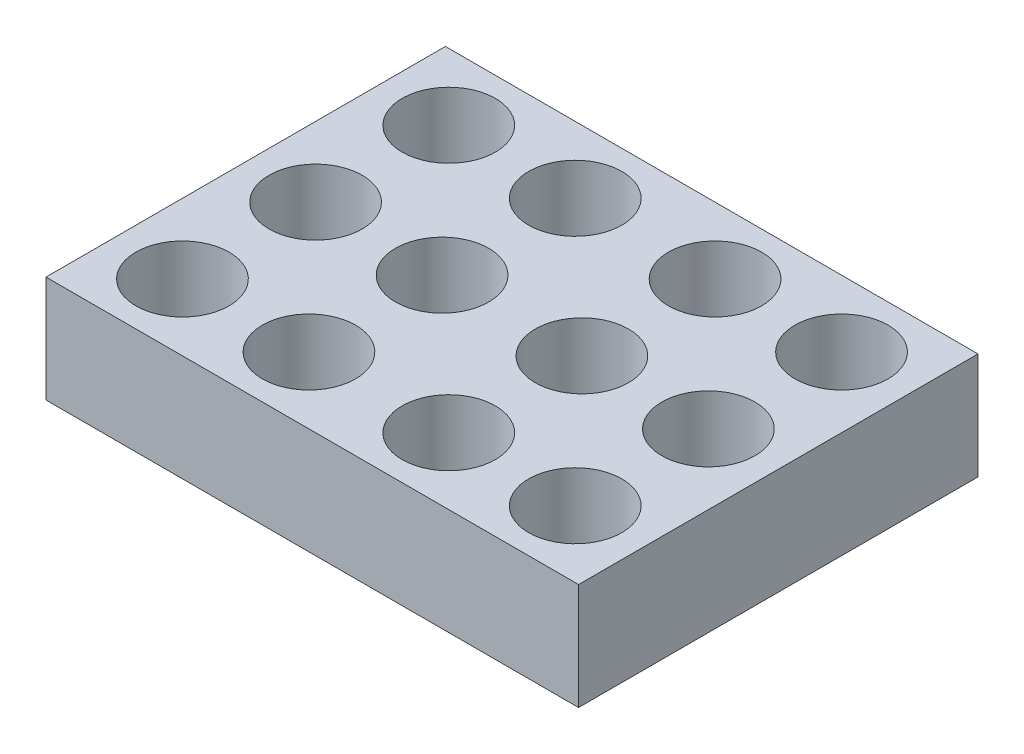
ISO-10303-21;
HEADER;
FILE_DESCRIPTION(('STEP AP214'),'2;1');
FILE_NAME('part.step','',(''),(''),'','','');
FILE_SCHEMA(('AUTOMOTIVE_DESIGN { 1 0 10303 214 1 1 1 1 }'));
ENDSEC;
DATA;
#1=APPLICATION_CONTEXT('core data for automotive mechanical design processes');
#2=APPLICATION_PROTOCOL_DEFINITION('international standard','automotive_design',2000,#1);
#3=PRODUCT_CONTEXT('',#1,'mechanical');
#4=PRODUCT('Part','Part','',(#3));
#5=PRODUCT_RELATED_PRODUCT_CATEGORY('part','',(#4));
#6=PRODUCT_DEFINITION_FORMATION('','',#4);
#7=PRODUCT_DEFINITION_CONTEXT('part definition',#1,'design');
#8=PRODUCT_DEFINITION('design','',#6,#7);
#9=PRODUCT_DEFINITION_SHAPE('','',#8);
#10=(LENGTH_UNIT() NAMED_UNIT(*) SI_UNIT(.MILLI.,.METRE.));
#11=(NAMED_UNIT(*) PLANE_ANGLE_UNIT() SI_UNIT($,.RADIAN.));
#12=(NAMED_UNIT(*) SI_UNIT($,.STERADIAN.) SOLID_ANGLE_UNIT());
#13=UNCERTAINTY_MEASURE_WITH_UNIT(LENGTH_MEASURE(1.E-05),#10,'distance_accuracy_value','');
#14=(GEOMETRIC_REPRESENTATION_CONTEXT(3) GLOBAL_UNCERTAINTY_ASSIGNED_CONTEXT((#13)) GLOBAL_UNIT_ASSIGNED_CONTEXT((#10,
#11,#12)) REPRESENTATION_CONTEXT('',''));
#15=CARTESIAN_POINT('',(0.,0.,0.));
#16=DIRECTION('',(0.,0.,1.));
#17=DIRECTION('',(1.,0.,0.));
#18=AXIS2_PLACEMENT_3D('',#15,#16,#17);
#19=CARTESIAN_POINT('',(200.,80.,150.));
#20=DIRECTION('',(-1.,0.,0.));
#21=DIRECTION('',(0.,0.,1.));
#22=AXIS2_PLACEMENT_3D('',#19,#20,#21);
#23=PLANE('',#22);
#24=DIRECTION('',(0.,0.,-1.));
#25=VECTOR('',#24,1.);
#26=CARTESIAN_POINT('',(200.,0.,150.));
#27=LINE('',#26,#25);
#28=CARTESIAN_POINT('',(200.,0.,150.));
#29=VERTEX_POINT('',#28);
#30=CARTESIAN_POINT('',(200.,0.,-150.));
#31=VERTEX_POINT('',#30);
#32=EDGE_CURVE('E107',#29,#31,#27,.T.);
#33=ORIENTED_EDGE('',*,*,#32,.T.);
#34=DIRECTION('',(0.,-1.,0.));
#35=VECTOR('',#34,1.);
#36=CARTESIAN_POINT('',(200.,80.,-150.));
#37=LINE('',#36,#35);
#38=CARTESIAN_POINT('',(200.,80.,-150.));
#39=VERTEX_POINT('',#38);
#40=EDGE_CURVE('E11',#39,#31,#37,.T.);
#41=ORIENTED_EDGE('',*,*,#40,.F.);
#42=DIRECTION('',(0.,0.,-1.));
#43=VECTOR('',#42,1.);
#44=CARTESIAN_POINT('',(200.,80.,150.));
#45=LINE('',#44,#43);
#46=CARTESIAN_POINT('',(200.,80.,150.));
#47=VERTEX_POINT('',#46);
#48=EDGE_CURVE('E91',#47,#39,#45,.T.);
#49=ORIENTED_EDGE('',*,*,#48,.F.);
#50=DIRECTION('',(0.,-1.,0.));
#51=VECTOR('',#50,1.);
#52=CARTESIAN_POINT('',(200.,80.,150.));
#53=LINE('',#52,#51);
#54=EDGE_CURVE('E103',#47,#29,#53,.T.);
#55=ORIENTED_EDGE('',*,*,#54,.T.);
#56=EDGE_LOOP('',(#33,#41,#49,#55));
#57=FACE_BOUND('',#56,.T.);
#58=ADVANCED_FACE('F39',(#57),#23,.F.);
#59=CARTESIAN_POINT('',(-200.,80.,-150.));
#60=DIRECTION('',(0.,0.,1.));
#61=DIRECTION('',(1.,0.,0.));
#62=AXIS2_PLACEMENT_3D('',#59,#60,#61);
#63=PLANE('',#62);
#64=DIRECTION('',(-1.,0.,0.));
#65=VECTOR('',#64,1.);
#66=CARTESIAN_POINT('',(-200.,0.,-150.));
#67=LINE('',#66,#65);
#68=CARTESIAN_POINT('',(-200.,0.,-150.));
#69=VERTEX_POINT('',#68);
#70=EDGE_CURVE('E96',#31,#69,#67,.T.);
#71=ORIENTED_EDGE('',*,*,#70,.T.);
#72=DIRECTION('',(0.,-1.,0.));
#73=VECTOR('',#72,1.);
#74=CARTESIAN_POINT('',(-200.,80.,-150.));
#75=LINE('',#74,#73);
#76=CARTESIAN_POINT('',(-200.,80.,-150.));
#77=VERTEX_POINT('',#76);
#78=EDGE_CURVE('E48',#77,#69,#75,.T.);
#79=ORIENTED_EDGE('',*,*,#78,.F.);
#80=DIRECTION('',(-1.,0.,0.));
#81=VECTOR('',#80,1.);
#82=CARTESIAN_POINT('',(-200.,80.,-150.));
#83=LINE('',#82,#81);
#84=EDGE_CURVE('E86',#39,#77,#83,.T.);
#85=ORIENTED_EDGE('',*,*,#84,.F.);
#86=ORIENTED_EDGE('',*,*,#40,.T.);
#87=EDGE_LOOP('',(#71,#79,#85,#86));
#88=FACE_BOUND('',#87,.T.);
#89=ADVANCED_FACE('F95',(#88),#63,.F.);
#90=CARTESIAN_POINT('',(-200.,80.,150.));
#91=DIRECTION('',(1.,0.,0.));
#92=DIRECTION('',(0.,0.,-1.));
#93=AXIS2_PLACEMENT_3D('',#90,#91,#92);
#94=PLANE('',#93);
#95=DIRECTION('',(0.,0.,1.));
#96=VECTOR('',#95,1.);
#97=CARTESIAN_POINT('',(-200.,0.,150.));
#98=LINE('',#97,#96);
#99=CARTESIAN_POINT('',(-200.,0.,150.));
#100=VERTEX_POINT('',#99);
#101=EDGE_CURVE('E73',#69,#100,#98,.T.);
#102=ORIENTED_EDGE('',*,*,#101,.T.);
#103=DIRECTION('',(0.,-1.,0.));
#104=VECTOR('',#103,1.);
#105=CARTESIAN_POINT('',(-200.,80.,150.));
#106=LINE('',#105,#104);
#107=CARTESIAN_POINT('',(-200.,80.,150.));
#108=VERTEX_POINT('',#107);
#109=EDGE_CURVE('E98',#108,#100,#106,.T.);
#110=ORIENTED_EDGE('',*,*,#109,.F.);
#111=DIRECTION('',(0.,0.,1.));
#112=VECTOR('',#111,1.);
#113=CARTESIAN_POINT('',(-200.,80.,150.));
#114=LINE('',#113,#112);
#115=EDGE_CURVE('E89',#77,#108,#114,.T.);
#116=ORIENTED_EDGE('',*,*,#115,.F.);
#117=ORIENTED_EDGE('',*,*,#78,.T.);
#118=EDGE_LOOP('',(#102,#110,#116,#117));
#119=FACE_BOUND('',#118,.T.);
#120=ADVANCED_FACE('F99',(#119),#94,.F.);
#121=CARTESIAN_POINT('',(-200.,80.,150.));
#122=DIRECTION('',(0.,0.,-1.));
#123=DIRECTION('',(-1.,0.,0.));
#124=AXIS2_PLACEMENT_3D('',#121,#122,#123);
#125=PLANE('',#124);
#126=DIRECTION('',(1.,0.,0.));
#127=VECTOR('',#126,1.);
#128=CARTESIAN_POINT('',(-200.,0.,150.));
#129=LINE('',#128,#127);
#130=EDGE_CURVE('E79',#100,#29,#129,.T.);
#131=ORIENTED_EDGE('',*,*,#130,.T.);
#132=ORIENTED_EDGE('',*,*,#54,.F.);
#133=DIRECTION('',(1.,0.,0.));
#134=VECTOR('',#133,1.);
#135=CARTESIAN_POINT('',(-200.,80.,150.));
#136=LINE('',#135,#134);
#137=EDGE_CURVE('E56',#108,#47,#136,.T.);
#138=ORIENTED_EDGE('',*,*,#137,.F.);
#139=ORIENTED_EDGE('',*,*,#109,.T.);
#140=EDGE_LOOP('',(#131,#132,#138,#139));
#141=FACE_BOUND('',#140,.T.);
#142=ADVANCED_FACE('F121',(#141),#125,.F.);
#143=CARTESIAN_POINT('',(0.,80.,0.));
#144=DIRECTION('',(0.,-1.,0.));
#145=DIRECTION('',(0.,0.,-1.));
#146=AXIS2_PLACEMENT_3D('',#143,#144,#145);
#147=PLANE('',#146);
#148=CARTESIAN_POINT('',(52.5,80.,-100.));
#149=DIRECTION('',(0.,1.,0.));
#150=DIRECTION('',(0.,0.,-1.));
#151=AXIS2_PLACEMENT_3D('',#148,#149,#150);
#152=CIRCLE('',#151,35.);
#153=CARTESIAN_POINT('',(52.5,80.,-135.));
#154=VERTEX_POINT('',#153);
#155=EDGE_CURVE('E177',#154,#154,#152,.T.);
#156=ORIENTED_EDGE('',*,*,#155,.F.);
#157=EDGE_LOOP('',(#156));
#158=FACE_BOUND('',#157,.T.);
#159=CARTESIAN_POINT('',(147.5,80.,0.));
#160=DIRECTION('',(0.,1.,0.));
#161=DIRECTION('',(0.,0.,-1.));
#162=AXIS2_PLACEMENT_3D('',#159,#160,#161);
#163=CIRCLE('',#162,35.);
#164=CARTESIAN_POINT('',(147.5,80.,-35.));
#165=VERTEX_POINT('',#164);
#166=EDGE_CURVE('E168',#165,#165,#163,.T.);
#167=ORIENTED_EDGE('',*,*,#166,.F.);
#168=EDGE_LOOP('',(#167));
#169=FACE_BOUND('',#168,.T.);
#170=CARTESIAN_POINT('',(147.5,80.,-100.));
#171=DIRECTION('',(0.,1.,0.));
#172=DIRECTION('',(0.,0.,-1.));
#173=AXIS2_PLACEMENT_3D('',#170,#171,#172);
#174=CIRCLE('',#173,35.);
#175=CARTESIAN_POINT('',(147.5,80.,-135.));
#176=VERTEX_POINT('',#175);
#177=EDGE_CURVE('E193',#176,#176,#174,.T.);
#178=ORIENTED_EDGE('',*,*,#177,.F.);
#179=EDGE_LOOP('',(#178));
#180=FACE_BOUND('',#179,.T.);
#181=CARTESIAN_POINT('',(-52.4999999999999,80.,100.));
#182=DIRECTION('',(0.,1.,0.));
#183=DIRECTION('',(0.,0.,-1.));
#184=AXIS2_PLACEMENT_3D('',#181,#182,#183);
#185=CIRCLE('',#184,35.);
#186=CARTESIAN_POINT('',(-52.4999999999999,80.,65.));
#187=VERTEX_POINT('',#186);
#188=EDGE_CURVE('E184',#187,#187,#185,.T.);
#189=ORIENTED_EDGE('',*,*,#188,.F.);
#190=EDGE_LOOP('',(#189));
#191=FACE_BOUND('',#190,.T.);
#192=CARTESIAN_POINT('',(-52.5,80.,-100.));
#193=DIRECTION('',(0.,1.,0.));
#194=DIRECTION('',(0.,0.,1.));
#195=AXIS2_PLACEMENT_3D('',#192,#193,#194);
#196=CIRCLE('',#195,35.);
#197=CARTESIAN_POINT('',(-52.5,80.,-65.));
#198=VERTEX_POINT('',#197);
#199=EDGE_CURVE('E145',#198,#198,#196,.T.);
#200=ORIENTED_EDGE('',*,*,#199,.F.);
#201=EDGE_LOOP('',(#200));
#202=FACE_BOUND('',#201,.T.);
#203=CARTESIAN_POINT('',(-147.5,80.,0.));
#204=DIRECTION('',(0.,1.,0.));
#205=DIRECTION('',(0.,0.,1.));
#206=AXIS2_PLACEMENT_3D('',#203,#204,#205);
#207=CIRCLE('',#206,35.);
#208=CARTESIAN_POINT('',(-147.5,80.,35.));
#209=VERTEX_POINT('',#208);
#210=EDGE_CURVE('E136',#209,#209,#207,.T.);
#211=ORIENTED_EDGE('',*,*,#210,.F.);
#212=EDGE_LOOP('',(#211));
#213=FACE_BOUND('',#212,.T.);
#214=CARTESIAN_POINT('',(-52.5,80.,0.));
#215=DIRECTION('',(0.,1.,0.));
#216=DIRECTION('',(0.,0.,1.));
#217=AXIS2_PLACEMENT_3D('',#214,#215,#216);
#218=CIRCLE('',#217,35.);
#219=CARTESIAN_POINT('',(-52.5,80.,35.));
#220=VERTEX_POINT('',#219);
#221=EDGE_CURVE('E161',#220,#220,#218,.T.);
#222=ORIENTED_EDGE('',*,*,#221,.F.);
#223=EDGE_LOOP('',(#222));
#224=FACE_BOUND('',#223,.T.);
#225=CARTESIAN_POINT('',(52.5,80.,0.));
#226=DIRECTION('',(0.,1.,0.));
#227=DIRECTION('',(0.,0.,-1.));
#228=AXIS2_PLACEMENT_3D('',#225,#226,#227);
#229=CIRCLE('',#228,35.);
#230=CARTESIAN_POINT('',(52.5,80.,-35.));
#231=VERTEX_POINT('',#230);
#232=EDGE_CURVE('E152',#231,#231,#229,.T.);
#233=ORIENTED_EDGE('',*,*,#232,.F.);
#234=EDGE_LOOP('',(#233));
#235=FACE_BOUND('',#234,.T.);
#236=CARTESIAN_POINT('',(52.4999999999999,80.,100.));
#237=DIRECTION('',(0.,1.,0.));
#238=DIRECTION('',(0.,0.,1.));
#239=AXIS2_PLACEMENT_3D('',#236,#237,#238);
#240=CIRCLE('',#239,35.);
#241=CARTESIAN_POINT('',(52.4999999999999,80.,135.));
#242=VERTEX_POINT('',#241);
#243=EDGE_CURVE('E216',#242,#242,#240,.T.);
#244=ORIENTED_EDGE('',*,*,#243,.F.);
#245=EDGE_LOOP('',(#244));
#246=FACE_BOUND('',#245,.T.);
#247=CARTESIAN_POINT('',(147.5,80.,100.));
#248=DIRECTION('',(0.,1.,0.));
#249=DIRECTION('',(0.,0.,1.));
#250=AXIS2_PLACEMENT_3D('',#247,#248,#249);
#251=CIRCLE('',#250,35.);
#252=CARTESIAN_POINT('',(147.5,80.,135.));
#253=VERTEX_POINT('',#252);
#254=EDGE_CURVE('E200',#253,#253,#251,.T.);
#255=ORIENTED_EDGE('',*,*,#254,.F.);
#256=EDGE_LOOP('',(#255));
#257=FACE_BOUND('',#256,.T.);
#258=CARTESIAN_POINT('',(-147.5,80.,100.));
#259=DIRECTION('',(0.,1.,0.));
#260=DIRECTION('',(0.,0.,-1.));
#261=AXIS2_PLACEMENT_3D('',#258,#259,#260);
#262=CIRCLE('',#261,35.);
#263=CARTESIAN_POINT('',(-147.5,80.,65.));
#264=VERTEX_POINT('',#263);
#265=EDGE_CURVE('E209',#264,#264,#262,.T.);
#266=ORIENTED_EDGE('',*,*,#265,.F.);
#267=EDGE_LOOP('',(#266));
#268=FACE_BOUND('',#267,.T.);
#269=CARTESIAN_POINT('',(-147.5,80.,-100.));
#270=DIRECTION('',(0.,1.,0.));
#271=DIRECTION('',(0.,0.,1.));
#272=AXIS2_PLACEMENT_3D('',#269,#270,#271);
#273=CIRCLE('',#272,35.);
#274=CARTESIAN_POINT('',(-147.5,80.,-65.));
#275=VERTEX_POINT('',#274);
#276=EDGE_CURVE('E128',#275,#275,#273,.T.);
#277=ORIENTED_EDGE('',*,*,#276,.F.);
#278=EDGE_LOOP('',(#277));
#279=FACE_BOUND('',#278,.T.);
#280=ORIENTED_EDGE('',*,*,#48,.T.);
#281=ORIENTED_EDGE('',*,*,#84,.T.);
#282=ORIENTED_EDGE('',*,*,#115,.T.);
#283=ORIENTED_EDGE('',*,*,#137,.T.);
#284=EDGE_LOOP('',(#280,#281,#282,#283));
#285=FACE_BOUND('',#284,.T.);
#286=ADVANCED_FACE('F87',(#158,#169,#180,#191,#202,#213,#224,#235,#246,#257,#268,#279,#285),
#147,.F.);
#287=CARTESIAN_POINT('',(0.,0.,0.));
#288=DIRECTION('',(0.,-1.,0.));
#289=DIRECTION('',(0.,0.,-1.));
#290=AXIS2_PLACEMENT_3D('',#287,#288,#289);
#291=PLANE('',#290);
#292=ORIENTED_EDGE('',*,*,#32,.F.);
#293=ORIENTED_EDGE('',*,*,#130,.F.);
#294=ORIENTED_EDGE('',*,*,#101,.F.);
#295=ORIENTED_EDGE('',*,*,#70,.F.);
#296=EDGE_LOOP('',(#292,#293,#294,#295));
#297=FACE_BOUND('',#296,.T.);
#298=ADVANCED_FACE('F124',(#297),#291,.T.);
#299=CARTESIAN_POINT('',(-147.5,9.99999999999999,-100.));
#300=DIRECTION('',(0.,1.,0.));
#301=DIRECTION('',(0.,0.,1.));
#302=AXIS2_PLACEMENT_3D('',#299,#300,#301);
#303=CYLINDRICAL_SURFACE('',#302,35.);
#304=CARTESIAN_POINT('',(-147.5,9.99999999999999,-100.));
#305=DIRECTION('',(0.,1.,0.));
#306=DIRECTION('',(0.,0.,1.));
#307=AXIS2_PLACEMENT_3D('',#304,#305,#306);
#308=CIRCLE('',#307,35.);
#309=CARTESIAN_POINT('',(-147.5,9.99999999999999,-65.));
#310=VERTEX_POINT('',#309);
#311=EDGE_CURVE('E111',#310,#310,#308,.T.);
#312=ORIENTED_EDGE('',*,*,#311,.F.);
#313=EDGE_LOOP('',(#312));
#314=FACE_BOUND('',#313,.T.);
#315=ORIENTED_EDGE('',*,*,#276,.T.);
#316=EDGE_LOOP('',(#315));
#317=FACE_BOUND('',#316,.T.);
#318=ADVANCED_FACE('F243',(#314,#317),#303,.F.);
#319=CARTESIAN_POINT('',(-147.5,9.99999999999999,-100.));
#320=DIRECTION('',(0.,1.,0.));
#321=DIRECTION('',(0.,0.,1.));
#322=AXIS2_PLACEMENT_3D('',#319,#320,#321);
#323=PLANE('',#322);
#324=ORIENTED_EDGE('',*,*,#311,.T.);
#325=EDGE_LOOP('',(#324));
#326=FACE_BOUND('',#325,.T.);
#327=ADVANCED_FACE('F245',(#326),#323,.T.);
#328=CARTESIAN_POINT('',(-147.5,9.99999999999999,100.));
#329=DIRECTION('',(0.,1.,0.));
#330=DIRECTION('',(0.,0.,1.));
#331=AXIS2_PLACEMENT_3D('',#328,#329,#330);
#332=CYLINDRICAL_SURFACE('',#331,35.);
#333=CARTESIAN_POINT('',(-147.5,9.99999999999999,100.));
#334=DIRECTION('',(0.,1.,0.));
#335=DIRECTION('',(0.,0.,-1.));
#336=AXIS2_PLACEMENT_3D('',#333,#334,#335);
#337=CIRCLE('',#336,35.);
#338=CARTESIAN_POINT('',(-147.5,9.99999999999999,65.));
#339=VERTEX_POINT('',#338);
#340=EDGE_CURVE('E189',#339,#339,#337,.T.);
#341=ORIENTED_EDGE('',*,*,#340,.F.);
#342=EDGE_LOOP('',(#341));
#343=FACE_BOUND('',#342,.T.);
#344=ORIENTED_EDGE('',*,*,#265,.T.);
#345=EDGE_LOOP('',(#344));
#346=FACE_BOUND('',#345,.T.);
#347=ADVANCED_FACE('F252',(#343,#346),#332,.F.);
#348=CARTESIAN_POINT('',(-147.5,9.99999999999999,100.));
#349=DIRECTION('',(0.,-1.,0.));
#350=DIRECTION('',(0.,0.,-1.));
#351=AXIS2_PLACEMENT_3D('',#348,#349,#350);
#352=PLANE('',#351);
#353=ORIENTED_EDGE('',*,*,#340,.T.);
#354=EDGE_LOOP('',(#353));
#355=FACE_BOUND('',#354,.T.);
#356=ADVANCED_FACE('F300',(#355),#352,.F.);
#357=CARTESIAN_POINT('',(147.5,9.99999999999999,100.));
#358=DIRECTION('',(0.,1.,0.));
#359=DIRECTION('',(0.,0.,1.));
#360=AXIS2_PLACEMENT_3D('',#357,#358,#359);
#361=CYLINDRICAL_SURFACE('',#360,35.);
#362=CARTESIAN_POINT('',(147.5,9.99999999999999,100.));
#363=DIRECTION('',(0.,1.,0.));
#364=DIRECTION('',(0.,0.,1.));
#365=AXIS2_PLACEMENT_3D('',#362,#363,#364);
#366=CIRCLE('',#365,35.);
#367=CARTESIAN_POINT('',(147.5,9.99999999999999,135.));
#368=VERTEX_POINT('',#367);
#369=EDGE_CURVE('E204',#368,#368,#366,.T.);
#370=ORIENTED_EDGE('',*,*,#369,.F.);
#371=EDGE_LOOP('',(#370));
#372=FACE_BOUND('',#371,.T.);
#373=ORIENTED_EDGE('',*,*,#254,.T.);
#374=EDGE_LOOP('',(#373));
#375=FACE_BOUND('',#374,.T.);
#376=ADVANCED_FACE('F309',(#372,#375),#361,.F.);
#377=CARTESIAN_POINT('',(147.5,9.99999999999999,100.));
#378=DIRECTION('',(0.,1.,0.));
#379=DIRECTION('',(0.,0.,1.));
#380=AXIS2_PLACEMENT_3D('',#377,#378,#379);
#381=PLANE('',#380);
#382=ORIENTED_EDGE('',*,*,#369,.T.);
#383=EDGE_LOOP('',(#382));
#384=FACE_BOUND('',#383,.T.);
#385=ADVANCED_FACE('F229',(#384),#381,.T.);
#386=CARTESIAN_POINT('',(52.4999999999999,9.99999999999999,100.));
#387=DIRECTION('',(0.,1.,0.));
#388=DIRECTION('',(0.,0.,1.));
#389=AXIS2_PLACEMENT_3D('',#386,#387,#388);
#390=CYLINDRICAL_SURFACE('',#389,35.);
#391=CARTESIAN_POINT('',(52.4999999999999,9.99999999999999,100.));
#392=DIRECTION('',(0.,1.,0.));
#393=DIRECTION('',(0.,0.,1.));
#394=AXIS2_PLACEMENT_3D('',#391,#392,#393);
#395=CIRCLE('',#394,35.);
#396=CARTESIAN_POINT('',(52.4999999999999,9.99999999999999,135.));
#397=VERTEX_POINT('',#396);
#398=EDGE_CURVE('E205',#397,#397,#395,.T.);
#399=ORIENTED_EDGE('',*,*,#398,.F.);
#400=EDGE_LOOP('',(#399));
#401=FACE_BOUND('',#400,.T.);
#402=ORIENTED_EDGE('',*,*,#243,.T.);
#403=EDGE_LOOP('',(#402));
#404=FACE_BOUND('',#403,.T.);
#405=ADVANCED_FACE('F226',(#401,#404),#390,.F.);
#406=CARTESIAN_POINT('',(52.4999999999999,9.99999999999999,100.));
#407=DIRECTION('',(0.,1.,0.));
#408=DIRECTION('',(0.,0.,1.));
#409=AXIS2_PLACEMENT_3D('',#406,#407,#408);
#410=PLANE('',#409);
#411=ORIENTED_EDGE('',*,*,#398,.T.);
#412=EDGE_LOOP('',(#411));
#413=FACE_BOUND('',#412,.T.);
#414=ADVANCED_FACE('F224',(#413),#410,.T.);
#415=CARTESIAN_POINT('',(52.5,9.99999999999999,0.));
#416=DIRECTION('',(0.,1.,0.));
#417=DIRECTION('',(0.,0.,1.));
#418=AXIS2_PLACEMENT_3D('',#415,#416,#417);
#419=CYLINDRICAL_SURFACE('',#418,35.);
#420=CARTESIAN_POINT('',(52.5,9.99999999999999,0.));
#421=DIRECTION('',(0.,1.,0.));
#422=DIRECTION('',(0.,0.,-1.));
#423=AXIS2_PLACEMENT_3D('',#420,#421,#422);
#424=CIRCLE('',#423,35.);
#425=CARTESIAN_POINT('',(52.5,9.99999999999999,-35.));
#426=VERTEX_POINT('',#425);
#427=EDGE_CURVE('E156',#426,#426,#424,.T.);
#428=ORIENTED_EDGE('',*,*,#427,.F.);
#429=EDGE_LOOP('',(#428));
#430=FACE_BOUND('',#429,.T.);
#431=ORIENTED_EDGE('',*,*,#232,.T.);
#432=EDGE_LOOP('',(#431));
#433=FACE_BOUND('',#432,.T.);
#434=ADVANCED_FACE('F339',(#430,#433),#419,.F.);
#435=CARTESIAN_POINT('',(52.5,9.99999999999999,0.));
#436=DIRECTION('',(0.,-1.,0.));
#437=DIRECTION('',(0.,0.,-1.));
#438=AXIS2_PLACEMENT_3D('',#435,#436,#437);
#439=PLANE('',#438);
#440=ORIENTED_EDGE('',*,*,#427,.T.);
#441=EDGE_LOOP('',(#440));
#442=FACE_BOUND('',#441,.T.);
#443=ADVANCED_FACE('F347',(#442),#439,.F.);
#444=CARTESIAN_POINT('',(-52.5,9.99999999999999,0.));
#445=DIRECTION('',(0.,1.,0.));
#446=DIRECTION('',(0.,0.,1.));
#447=AXIS2_PLACEMENT_3D('',#444,#445,#446);
#448=CYLINDRICAL_SURFACE('',#447,35.);
#449=CARTESIAN_POINT('',(-52.5,9.99999999999999,0.));
#450=DIRECTION('',(0.,1.,0.));
#451=DIRECTION('',(0.,0.,1.));
#452=AXIS2_PLACEMENT_3D('',#449,#450,#451);
#453=CIRCLE('',#452,35.);
#454=CARTESIAN_POINT('',(-52.5,9.99999999999999,35.));
#455=VERTEX_POINT('',#454);
#456=EDGE_CURVE('E141',#455,#455,#453,.T.);
#457=ORIENTED_EDGE('',*,*,#456,.F.);
#458=EDGE_LOOP('',(#457));
#459=FACE_BOUND('',#458,.T.);
#460=ORIENTED_EDGE('',*,*,#221,.T.);
#461=EDGE_LOOP('',(#460));
#462=FACE_BOUND('',#461,.T.);
#463=ADVANCED_FACE('F356',(#459,#462),#448,.F.);
#464=CARTESIAN_POINT('',(-52.5,9.99999999999999,0.));
#465=DIRECTION('',(0.,1.,0.));
#466=DIRECTION('',(0.,0.,1.));
#467=AXIS2_PLACEMENT_3D('',#464,#465,#466);
#468=PLANE('',#467);
#469=ORIENTED_EDGE('',*,*,#456,.T.);
#470=EDGE_LOOP('',(#469));
#471=FACE_BOUND('',#470,.T.);
#472=ADVANCED_FACE('F365',(#471),#468,.T.);
#473=CARTESIAN_POINT('',(-147.5,9.99999999999999,0.));
#474=DIRECTION('',(0.,1.,0.));
#475=DIRECTION('',(0.,0.,1.));
#476=AXIS2_PLACEMENT_3D('',#473,#474,#475);
#477=CYLINDRICAL_SURFACE('',#476,35.);
#478=CARTESIAN_POINT('',(-147.5,9.99999999999999,0.));
#479=DIRECTION('',(0.,1.,0.));
#480=DIRECTION('',(0.,0.,1.));
#481=AXIS2_PLACEMENT_3D('',#478,#479,#480);
#482=CIRCLE('',#481,35.);
#483=CARTESIAN_POINT('',(-147.5,9.99999999999999,35.));
#484=VERTEX_POINT('',#483);
#485=EDGE_CURVE('E140',#484,#484,#482,.T.);
#486=ORIENTED_EDGE('',*,*,#485,.F.);
#487=EDGE_LOOP('',(#486));
#488=FACE_BOUND('',#487,.T.);
#489=ORIENTED_EDGE('',*,*,#210,.T.);
#490=EDGE_LOOP('',(#489));
#491=FACE_BOUND('',#490,.T.);
#492=ADVANCED_FACE('F374',(#488,#491),#477,.F.);
#493=CARTESIAN_POINT('',(-147.5,9.99999999999999,0.));
#494=DIRECTION('',(0.,1.,0.));
#495=DIRECTION('',(0.,0.,1.));
#496=AXIS2_PLACEMENT_3D('',#493,#494,#495);
#497=PLANE('',#496);
#498=ORIENTED_EDGE('',*,*,#485,.T.);
#499=EDGE_LOOP('',(#498));
#500=FACE_BOUND('',#499,.T.);
#501=ADVANCED_FACE('F383',(#500),#497,.T.);
#502=CARTESIAN_POINT('',(-52.5,9.99999999999999,-100.));
#503=DIRECTION('',(0.,1.,0.));
#504=DIRECTION('',(0.,0.,1.));
#505=AXIS2_PLACEMENT_3D('',#502,#503,#504);
#506=CYLINDRICAL_SURFACE('',#505,35.);
#507=CARTESIAN_POINT('',(-52.5,9.99999999999999,-100.));
#508=DIRECTION('',(0.,1.,0.));
#509=DIRECTION('',(0.,0.,1.));
#510=AXIS2_PLACEMENT_3D('',#507,#508,#509);
#511=CIRCLE('',#510,35.);
#512=CARTESIAN_POINT('',(-52.5,9.99999999999999,-65.));
#513=VERTEX_POINT('',#512);
#514=EDGE_CURVE('E132',#513,#513,#511,.T.);
#515=ORIENTED_EDGE('',*,*,#514,.F.);
#516=EDGE_LOOP('',(#515));
#517=FACE_BOUND('',#516,.T.);
#518=ORIENTED_EDGE('',*,*,#199,.T.);
#519=EDGE_LOOP('',(#518));
#520=FACE_BOUND('',#519,.T.);
#521=ADVANCED_FACE('F392',(#517,#520),#506,.F.);
#522=CARTESIAN_POINT('',(-52.5,9.99999999999999,-100.));
#523=DIRECTION('',(0.,1.,0.));
#524=DIRECTION('',(0.,0.,1.));
#525=AXIS2_PLACEMENT_3D('',#522,#523,#524);
#526=PLANE('',#525);
#527=ORIENTED_EDGE('',*,*,#514,.T.);
#528=EDGE_LOOP('',(#527));
#529=FACE_BOUND('',#528,.T.);
#530=ADVANCED_FACE('F401',(#529),#526,.T.);
#531=CARTESIAN_POINT('',(-52.4999999999999,9.99999999999999,100.));
#532=DIRECTION('',(0.,1.,0.));
#533=DIRECTION('',(0.,0.,1.));
#534=AXIS2_PLACEMENT_3D('',#531,#532,#533);
#535=CYLINDRICAL_SURFACE('',#534,35.);
#536=CARTESIAN_POINT('',(-52.4999999999999,9.99999999999999,100.));
#537=DIRECTION('',(0.,1.,0.));
#538=DIRECTION('',(0.,0.,-1.));
#539=AXIS2_PLACEMENT_3D('',#536,#537,#538);
#540=CIRCLE('',#539,35.);
#541=CARTESIAN_POINT('',(-52.4999999999999,9.99999999999999,65.));
#542=VERTEX_POINT('',#541);
#543=EDGE_CURVE('E188',#542,#542,#540,.T.);
#544=ORIENTED_EDGE('',*,*,#543,.F.);
#545=EDGE_LOOP('',(#544));
#546=FACE_BOUND('',#545,.T.);
#547=ORIENTED_EDGE('',*,*,#188,.T.);
#548=EDGE_LOOP('',(#547));
#549=FACE_BOUND('',#548,.T.);
#550=ADVANCED_FACE('F410',(#546,#549),#535,.F.);
#551=CARTESIAN_POINT('',(-52.4999999999999,9.99999999999999,100.));
#552=DIRECTION('',(0.,-1.,0.));
#553=DIRECTION('',(0.,0.,-1.));
#554=AXIS2_PLACEMENT_3D('',#551,#552,#553);
#555=PLANE('',#554);
#556=ORIENTED_EDGE('',*,*,#543,.T.);
#557=EDGE_LOOP('',(#556));
#558=FACE_BOUND('',#557,.T.);
#559=ADVANCED_FACE('F419',(#558),#555,.F.);
#560=CARTESIAN_POINT('',(147.5,9.99999999999999,-100.));
#561=DIRECTION('',(0.,1.,0.));
#562=DIRECTION('',(0.,0.,1.));
#563=AXIS2_PLACEMENT_3D('',#560,#561,#562);
#564=CYLINDRICAL_SURFACE('',#563,35.);
#565=CARTESIAN_POINT('',(147.5,9.99999999999999,-100.));
#566=DIRECTION('',(0.,1.,0.));
#567=DIRECTION('',(0.,0.,-1.));
#568=AXIS2_PLACEMENT_3D('',#565,#566,#567);
#569=CIRCLE('',#568,35.);
#570=CARTESIAN_POINT('',(147.5,9.99999999999999,-135.));
#571=VERTEX_POINT('',#570);
#572=EDGE_CURVE('E173',#571,#571,#569,.T.);
#573=ORIENTED_EDGE('',*,*,#572,.F.);
#574=EDGE_LOOP('',(#573));
#575=FACE_BOUND('',#574,.T.);
#576=ORIENTED_EDGE('',*,*,#177,.T.);
#577=EDGE_LOOP('',(#576));
#578=FACE_BOUND('',#577,.T.);
#579=ADVANCED_FACE('F428',(#575,#578),#564,.F.);
#580=CARTESIAN_POINT('',(147.5,9.99999999999999,-100.));
#581=DIRECTION('',(0.,-1.,0.));
#582=DIRECTION('',(0.,0.,-1.));
#583=AXIS2_PLACEMENT_3D('',#580,#581,#582);
#584=PLANE('',#583);
#585=ORIENTED_EDGE('',*,*,#572,.T.);
#586=EDGE_LOOP('',(#585));
#587=FACE_BOUND('',#586,.T.);
#588=ADVANCED_FACE('F437',(#587),#584,.F.);
#589=CARTESIAN_POINT('',(147.5,9.99999999999999,0.));
#590=DIRECTION('',(0.,1.,0.));
#591=DIRECTION('',(0.,0.,1.));
#592=AXIS2_PLACEMENT_3D('',#589,#590,#591);
#593=CYLINDRICAL_SURFACE('',#592,35.);
#594=CARTESIAN_POINT('',(147.5,9.99999999999999,0.));
#595=DIRECTION('',(0.,1.,0.));
#596=DIRECTION('',(0.,0.,-1.));
#597=AXIS2_PLACEMENT_3D('',#594,#595,#596);
#598=CIRCLE('',#597,35.);
#599=CARTESIAN_POINT('',(147.5,9.99999999999999,-35.));
#600=VERTEX_POINT('',#599);
#601=EDGE_CURVE('E172',#600,#600,#598,.T.);
#602=ORIENTED_EDGE('',*,*,#601,.F.);
#603=EDGE_LOOP('',(#602));
#604=FACE_BOUND('',#603,.T.);
#605=ORIENTED_EDGE('',*,*,#166,.T.);
#606=EDGE_LOOP('',(#605));
#607=FACE_BOUND('',#606,.T.);
#608=ADVANCED_FACE('F446',(#604,#607),#593,.F.);
#609=CARTESIAN_POINT('',(147.5,9.99999999999999,0.));
#610=DIRECTION('',(0.,-1.,0.));
#611=DIRECTION('',(0.,0.,-1.));
#612=AXIS2_PLACEMENT_3D('',#609,#610,#611);
#613=PLANE('',#612);
#614=ORIENTED_EDGE('',*,*,#601,.T.);
#615=EDGE_LOOP('',(#614));
#616=FACE_BOUND('',#615,.T.);
#617=ADVANCED_FACE('F455',(#616),#613,.F.);
#618=CARTESIAN_POINT('',(52.5,9.99999999999999,-100.));
#619=DIRECTION('',(0.,1.,0.));
#620=DIRECTION('',(0.,0.,1.));
#621=AXIS2_PLACEMENT_3D('',#618,#619,#620);
#622=CYLINDRICAL_SURFACE('',#621,35.);
#623=CARTESIAN_POINT('',(52.5,9.99999999999999,-100.));
#624=DIRECTION('',(0.,1.,0.));
#625=DIRECTION('',(0.,0.,-1.));
#626=AXIS2_PLACEMENT_3D('',#623,#624,#625);
#627=CIRCLE('',#626,35.);
#628=CARTESIAN_POINT('',(52.5,9.99999999999999,-135.));
#629=VERTEX_POINT('',#628);
#630=EDGE_CURVE('E157',#629,#629,#627,.T.);
#631=ORIENTED_EDGE('',*,*,#630,.F.);
#632=EDGE_LOOP('',(#631));
#633=FACE_BOUND('',#632,.T.);
#634=ORIENTED_EDGE('',*,*,#155,.T.);
#635=EDGE_LOOP('',(#634));
#636=FACE_BOUND('',#635,.T.);
#637=ADVANCED_FACE('F464',(#633,#636),#622,.F.);
#638=CARTESIAN_POINT('',(52.5,9.99999999999999,-100.));
#639=DIRECTION('',(0.,-1.,0.));
#640=DIRECTION('',(0.,0.,-1.));
#641=AXIS2_PLACEMENT_3D('',#638,#639,#640);
#642=PLANE('',#641);
#643=ORIENTED_EDGE('',*,*,#630,.T.);
#644=EDGE_LOOP('',(#643));
#645=FACE_BOUND('',#644,.T.);
#646=ADVANCED_FACE('F473',(#645),#642,.F.);
#647=CLOSED_SHELL('',(#58,#89,#120,#142,#286,#298,#318,#327,#347,#356,#376,#385,#405,#414,#434,
#443,#463,#472,#492,#501,#521,#530,#550,#559,#579,#588,#608,#617,#637,#646));
#648=MANIFOLD_SOLID_BREP('B2',#647);
#649=ADVANCED_BREP_SHAPE_REPRESENTATION('',(#18,#648),#14);
#650=SHAPE_DEFINITION_REPRESENTATION(#9,#649);
ENDSEC;
END-ISO-10303-21;
